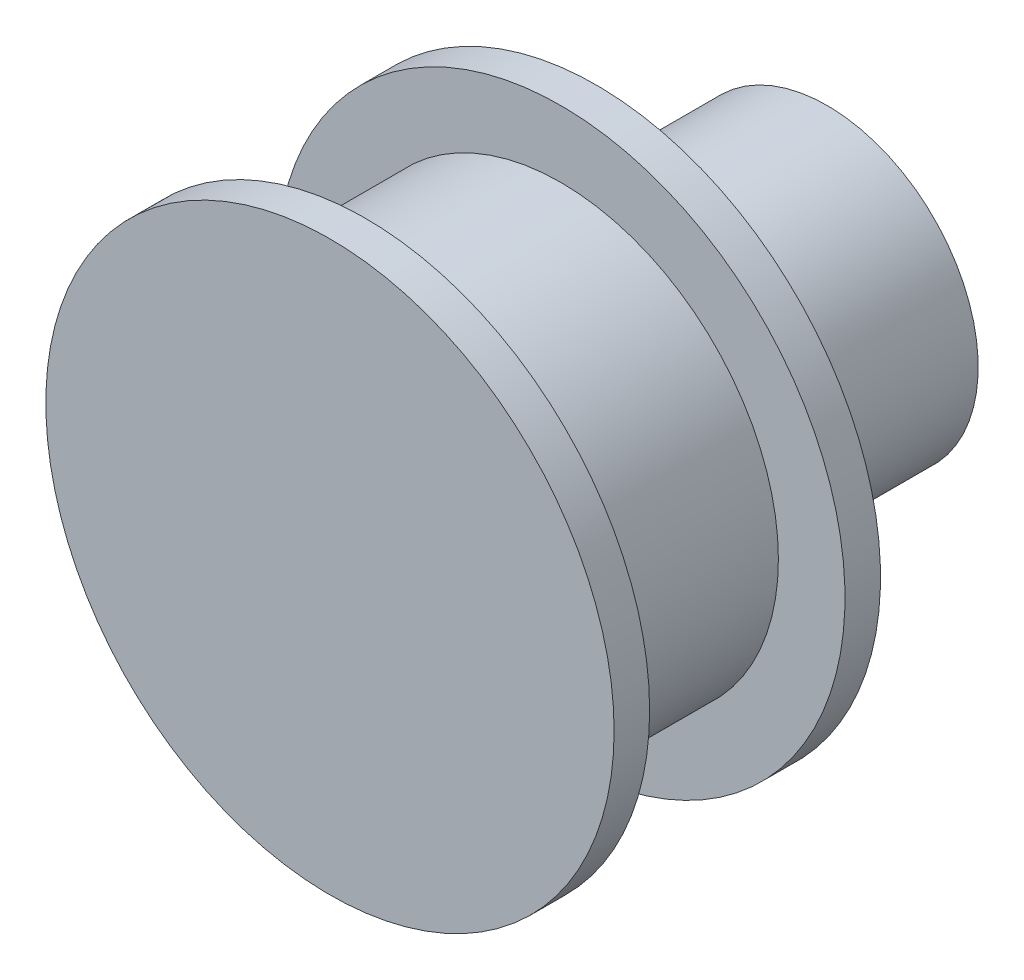
ISO-10303-21;
HEADER;
FILE_DESCRIPTION(('STEP AP214'),'2;1');
FILE_NAME('part.step','',(''),(''),'','','');
FILE_SCHEMA(('AUTOMOTIVE_DESIGN { 1 0 10303 214 1 1 1 1 }'));
ENDSEC;
DATA;
#1=APPLICATION_CONTEXT('core data for automotive mechanical design processes');
#2=APPLICATION_PROTOCOL_DEFINITION('international standard','automotive_design',2000,#1);
#3=PRODUCT_CONTEXT('',#1,'mechanical');
#4=PRODUCT('Part','Part','',(#3));
#5=PRODUCT_RELATED_PRODUCT_CATEGORY('part','',(#4));
#6=PRODUCT_DEFINITION_FORMATION('','',#4);
#7=PRODUCT_DEFINITION_CONTEXT('part definition',#1,'design');
#8=PRODUCT_DEFINITION('design','',#6,#7);
#9=PRODUCT_DEFINITION_SHAPE('','',#8);
#10=(LENGTH_UNIT() NAMED_UNIT(*) SI_UNIT(.MILLI.,.METRE.));
#11=(NAMED_UNIT(*) PLANE_ANGLE_UNIT() SI_UNIT($,.RADIAN.));
#12=(NAMED_UNIT(*) SI_UNIT($,.STERADIAN.) SOLID_ANGLE_UNIT());
#13=UNCERTAINTY_MEASURE_WITH_UNIT(LENGTH_MEASURE(1.E-05),#10,'distance_accuracy_value','');
#14=(GEOMETRIC_REPRESENTATION_CONTEXT(3) GLOBAL_UNCERTAINTY_ASSIGNED_CONTEXT((#13)) GLOBAL_UNIT_ASSIGNED_CONTEXT((#10,
#11,#12)) REPRESENTATION_CONTEXT('',''));
#15=CARTESIAN_POINT('',(0.,0.,0.));
#16=DIRECTION('',(0.,0.,1.));
#17=DIRECTION('',(1.,0.,0.));
#18=AXIS2_PLACEMENT_3D('',#15,#16,#17);
#19=CARTESIAN_POINT('',(0.,0.,-3.));
#20=DIRECTION('',(0.,0.,-1.));
#21=DIRECTION('',(-1.,0.,0.));
#22=AXIS2_PLACEMENT_3D('',#19,#20,#21);
#23=PLANE('',#22);
#24=CARTESIAN_POINT('',(0.,0.,-3.));
#25=DIRECTION('',(0.,0.,-1.));
#26=DIRECTION('',(-1.,0.,0.));
#27=AXIS2_PLACEMENT_3D('',#24,#25,#26);
#28=CIRCLE('',#27,10.);
#29=CARTESIAN_POINT('',(-10.,0.,-3.));
#30=VERTEX_POINT('',#29);
#31=EDGE_CURVE('E57',#30,#30,#28,.T.);
#32=ORIENTED_EDGE('',*,*,#31,.T.);
#33=EDGE_LOOP('',(#32));
#34=FACE_BOUND('',#33,.T.);
#35=CARTESIAN_POINT('',(0.,0.,-3.));
#36=DIRECTION('',(0.,0.,-1.));
#37=DIRECTION('',(-1.,0.,0.));
#38=AXIS2_PLACEMENT_3D('',#35,#36,#37);
#39=CIRCLE('',#38,8.5);
#40=CARTESIAN_POINT('',(-8.5,0.,-3.));
#41=VERTEX_POINT('',#40);
#42=EDGE_CURVE('E66',#41,#41,#39,.T.);
#43=ORIENTED_EDGE('',*,*,#42,.F.);
#44=EDGE_LOOP('',(#43));
#45=FACE_BOUND('',#44,.T.);
#46=ADVANCED_FACE('F33',(#34,#45),#23,.T.);
#47=CARTESIAN_POINT('',(0.,0.,-2.));
#48=DIRECTION('',(0.,0.,-1.));
#49=DIRECTION('',(-1.,0.,0.));
#50=AXIS2_PLACEMENT_3D('',#47,#48,#49);
#51=PLANE('',#50);
#52=CARTESIAN_POINT('',(0.,0.,-2.));
#53=DIRECTION('',(0.,0.,-1.));
#54=DIRECTION('',(-1.,0.,0.));
#55=AXIS2_PLACEMENT_3D('',#52,#53,#54);
#56=CIRCLE('',#55,16.);
#57=CARTESIAN_POINT('',(-16.,0.,-2.));
#58=VERTEX_POINT('',#57);
#59=EDGE_CURVE('E53',#58,#58,#56,.T.);
#60=ORIENTED_EDGE('',*,*,#59,.T.);
#61=EDGE_LOOP('',(#60));
#62=FACE_BOUND('',#61,.T.);
#63=CARTESIAN_POINT('',(0.,0.,-2.));
#64=DIRECTION('',(0.,0.,-1.));
#65=DIRECTION('',(-1.,0.,0.));
#66=AXIS2_PLACEMENT_3D('',#63,#64,#65);
#67=CIRCLE('',#66,10.);
#68=CARTESIAN_POINT('',(-10.,0.,-2.));
#69=VERTEX_POINT('',#68);
#70=EDGE_CURVE('E60',#69,#69,#67,.T.);
#71=ORIENTED_EDGE('',*,*,#70,.F.);
#72=EDGE_LOOP('',(#71));
#73=FACE_BOUND('',#72,.T.);
#74=ADVANCED_FACE('F100',(#62,#73),#51,.T.);
#75=CARTESIAN_POINT('',(0.,0.,11.));
#76=DIRECTION('',(0.,0.,-1.));
#77=DIRECTION('',(-1.,0.,0.));
#78=AXIS2_PLACEMENT_3D('',#75,#76,#77);
#79=CYLINDRICAL_SURFACE('',#78,12.25);
#80=CARTESIAN_POINT('',(0.,0.,11.));
#81=DIRECTION('',(0.,0.,1.));
#82=DIRECTION('',(1.,0.,0.));
#83=AXIS2_PLACEMENT_3D('',#80,#81,#82);
#84=CIRCLE('',#83,12.25);
#85=CARTESIAN_POINT('',(12.25,0.,11.));
#86=VERTEX_POINT('',#85);
#87=EDGE_CURVE('E44',#86,#86,#84,.T.);
#88=ORIENTED_EDGE('',*,*,#87,.F.);
#89=EDGE_LOOP('',(#88));
#90=FACE_BOUND('',#89,.T.);
#91=CARTESIAN_POINT('',(0.,0.,0.));
#92=DIRECTION('',(0.,0.,-1.));
#93=DIRECTION('',(-1.,0.,0.));
#94=AXIS2_PLACEMENT_3D('',#91,#92,#93);
#95=CIRCLE('',#94,12.25);
#96=CARTESIAN_POINT('',(-12.25,0.,0.));
#97=VERTEX_POINT('',#96);
#98=EDGE_CURVE('E48',#97,#97,#95,.T.);
#99=ORIENTED_EDGE('',*,*,#98,.F.);
#100=EDGE_LOOP('',(#99));
#101=FACE_BOUND('',#100,.T.);
#102=ADVANCED_FACE('F96',(#90,#101),#79,.T.);
#103=CARTESIAN_POINT('',(0.,0.,0.));
#104=DIRECTION('',(0.,0.,-1.));
#105=DIRECTION('',(-1.,0.,0.));
#106=AXIS2_PLACEMENT_3D('',#103,#104,#105);
#107=PLANE('',#106);
#108=CARTESIAN_POINT('',(0.,0.,0.));
#109=DIRECTION('',(0.,0.,-1.));
#110=DIRECTION('',(-1.,0.,0.));
#111=AXIS2_PLACEMENT_3D('',#108,#109,#110);
#112=CIRCLE('',#111,16.);
#113=CARTESIAN_POINT('',(-16.,0.,0.));
#114=VERTEX_POINT('',#113);
#115=EDGE_CURVE('E54',#114,#114,#112,.T.);
#116=ORIENTED_EDGE('',*,*,#115,.F.);
#117=EDGE_LOOP('',(#116));
#118=FACE_BOUND('',#117,.T.);
#119=ORIENTED_EDGE('',*,*,#98,.T.);
#120=EDGE_LOOP('',(#119));
#121=FACE_BOUND('',#120,.T.);
#122=ADVANCED_FACE('F99',(#118,#121),#107,.F.);
#123=CARTESIAN_POINT('',(0.,0.,-2.));
#124=DIRECTION('',(0.,0.,1.));
#125=DIRECTION('',(1.,0.,0.));
#126=AXIS2_PLACEMENT_3D('',#123,#124,#125);
#127=CYLINDRICAL_SURFACE('',#126,16.);
#128=ORIENTED_EDGE('',*,*,#59,.F.);
#129=EDGE_LOOP('',(#128));
#130=FACE_BOUND('',#129,.T.);
#131=ORIENTED_EDGE('',*,*,#115,.T.);
#132=EDGE_LOOP('',(#131));
#133=FACE_BOUND('',#132,.T.);
#134=ADVANCED_FACE('F104',(#130,#133),#127,.T.);
#135=CARTESIAN_POINT('',(0.,0.,-3.));
#136=DIRECTION('',(0.,0.,1.));
#137=DIRECTION('',(1.,0.,0.));
#138=AXIS2_PLACEMENT_3D('',#135,#136,#137);
#139=CYLINDRICAL_SURFACE('',#138,10.);
#140=ORIENTED_EDGE('',*,*,#31,.F.);
#141=EDGE_LOOP('',(#140));
#142=FACE_BOUND('',#141,.T.);
#143=ORIENTED_EDGE('',*,*,#70,.T.);
#144=EDGE_LOOP('',(#143));
#145=FACE_BOUND('',#144,.T.);
#146=ADVANCED_FACE('F110',(#142,#145),#139,.T.);
#147=CARTESIAN_POINT('',(0.,0.,-15.));
#148=DIRECTION('',(0.,0.,1.));
#149=DIRECTION('',(1.,0.,0.));
#150=AXIS2_PLACEMENT_3D('',#147,#148,#149);
#151=CYLINDRICAL_SURFACE('',#150,8.5);
#152=CARTESIAN_POINT('',(0.,0.,-15.));
#153=DIRECTION('',(0.,0.,-1.));
#154=DIRECTION('',(-1.,0.,0.));
#155=AXIS2_PLACEMENT_3D('',#152,#153,#154);
#156=CIRCLE('',#155,8.5);
#157=CARTESIAN_POINT('',(-8.5,0.,-15.));
#158=VERTEX_POINT('',#157);
#159=EDGE_CURVE('E63',#158,#158,#156,.T.);
#160=ORIENTED_EDGE('',*,*,#159,.F.);
#161=EDGE_LOOP('',(#160));
#162=FACE_BOUND('',#161,.T.);
#163=ORIENTED_EDGE('',*,*,#42,.T.);
#164=EDGE_LOOP('',(#163));
#165=FACE_BOUND('',#164,.T.);
#166=ADVANCED_FACE('F125',(#162,#165),#151,.T.);
#167=CARTESIAN_POINT('',(0.,0.,-15.));
#168=DIRECTION('',(0.,0.,-1.));
#169=DIRECTION('',(-1.,0.,0.));
#170=AXIS2_PLACEMENT_3D('',#167,#168,#169);
#171=PLANE('',#170);
#172=CARTESIAN_POINT('',(0.,0.,-15.));
#173=DIRECTION('',(0.,0.,-1.));
#174=DIRECTION('',(-1.,0.,0.));
#175=AXIS2_PLACEMENT_3D('',#172,#173,#174);
#176=CIRCLE('',#175,7.00000000000003);
#177=CARTESIAN_POINT('',(-7.00000000000003,0.,-15.));
#178=VERTEX_POINT('',#177);
#179=EDGE_CURVE('E10',#178,#178,#176,.F.);
#180=ORIENTED_EDGE('',*,*,#179,.T.);
#181=EDGE_LOOP('',(#180));
#182=FACE_BOUND('',#181,.T.);
#183=ORIENTED_EDGE('',*,*,#159,.T.);
#184=EDGE_LOOP('',(#183));
#185=FACE_BOUND('',#184,.T.);
#186=ADVANCED_FACE('F132',(#182,#185),#171,.T.);
#187=CARTESIAN_POINT('',(0.,0.,11.));
#188=DIRECTION('',(0.,0.,-1.));
#189=DIRECTION('',(-1.,0.,0.));
#190=AXIS2_PLACEMENT_3D('',#187,#188,#189);
#191=CYLINDRICAL_SURFACE('',#190,6.);
#192=CARTESIAN_POINT('',(0.,0.,-14.));
#193=DIRECTION('',(0.,0.,-1.));
#194=DIRECTION('',(-1.,0.,0.));
#195=AXIS2_PLACEMENT_3D('',#192,#193,#194);
#196=CIRCLE('',#195,6.);
#197=CARTESIAN_POINT('',(-6.,0.,-14.));
#198=VERTEX_POINT('',#197);
#199=EDGE_CURVE('E40',#198,#198,#196,.T.);
#200=CARTESIAN_POINT('',(0.,0.,11.));
#201=DIRECTION('',(0.,0.,-1.));
#202=DIRECTION('',(-1.,0.,0.));
#203=AXIS2_PLACEMENT_3D('',#200,#201,#202);
#204=CIRCLE('',#203,6.);
#205=CARTESIAN_POINT('',(-6.,0.,11.));
#206=VERTEX_POINT('',#205);
#207=EDGE_CURVE('E69',#206,#206,#204,.T.);
#208=CARTESIAN_POINT('',(-6.,0.,-14.));
#209=CARTESIAN_POINT('',(-6.,0.,-13.7395833333333));
#210=CARTESIAN_POINT('',(-6.,0.,-13.4791666666666));
#211=CARTESIAN_POINT('',(-6.,0.,-12.9583333333333));
#212=CARTESIAN_POINT('',(-6.,0.,-12.6979166666666));
#213=CARTESIAN_POINT('',(-6.,0.,-12.1770833333333));
#214=CARTESIAN_POINT('',(-6.,0.,-11.9166666666666));
#215=CARTESIAN_POINT('',(-6.,0.,-11.3958333333333));
#216=CARTESIAN_POINT('',(-6.,0.,-11.1354166666666));
#217=CARTESIAN_POINT('',(-6.,0.,-10.6145833333333));
#218=CARTESIAN_POINT('',(-6.,0.,-10.3541666666666));
#219=CARTESIAN_POINT('',(-6.,0.,-9.83333333333331));
#220=CARTESIAN_POINT('',(-6.,0.,-9.57291666666664));
#221=CARTESIAN_POINT('',(-6.,0.,-9.05208333333331));
#222=CARTESIAN_POINT('',(-6.,0.,-8.79166666666664));
#223=CARTESIAN_POINT('',(-6.,0.,-8.27083333333331));
#224=CARTESIAN_POINT('',(-6.,0.,-8.01041666666664));
#225=CARTESIAN_POINT('',(-6.,0.,-7.48958333333331));
#226=CARTESIAN_POINT('',(-6.,0.,-7.22916666666664));
#227=CARTESIAN_POINT('',(-6.,0.,-6.70833333333331));
#228=CARTESIAN_POINT('',(-6.,0.,-6.44791666666664));
#229=CARTESIAN_POINT('',(-6.,0.,-5.92708333333331));
#230=CARTESIAN_POINT('',(-6.,0.,-5.66666666666665));
#231=CARTESIAN_POINT('',(-6.,0.,-5.14583333333331));
#232=CARTESIAN_POINT('',(-6.,0.,-4.88541666666665));
#233=CARTESIAN_POINT('',(-6.,0.,-4.36458333333332));
#234=CARTESIAN_POINT('',(-6.,0.,-4.10416666666665));
#235=CARTESIAN_POINT('',(-6.,0.,-3.58333333333332));
#236=CARTESIAN_POINT('',(-6.,0.,-3.32291666666665));
#237=CARTESIAN_POINT('',(-6.,0.,-2.80208333333332));
#238=CARTESIAN_POINT('',(-6.,0.,-2.54166666666665));
#239=CARTESIAN_POINT('',(-6.,0.,-2.02083333333332));
#240=CARTESIAN_POINT('',(-6.,0.,-1.76041666666665));
#241=CARTESIAN_POINT('',(-6.,0.,-1.23958333333332));
#242=CARTESIAN_POINT('',(-6.,0.,-0.979166666666653));
#243=CARTESIAN_POINT('',(-6.,0.,-0.45833333333332));
#244=CARTESIAN_POINT('',(-6.,0.,-0.197916666666654));
#245=CARTESIAN_POINT('',(-6.,0.,0.322916666666679));
#246=CARTESIAN_POINT('',(-6.,0.,0.583333333333345));
#247=CARTESIAN_POINT('',(-6.,0.,1.10416666666668));
#248=CARTESIAN_POINT('',(-6.,0.,1.36458333333334));
#249=CARTESIAN_POINT('',(-6.,0.,1.88541666666668));
#250=CARTESIAN_POINT('',(-6.,0.,2.14583333333334));
#251=CARTESIAN_POINT('',(-6.,0.,2.66666666666668));
#252=CARTESIAN_POINT('',(-6.,0.,2.92708333333334));
#253=CARTESIAN_POINT('',(-6.,0.,3.44791666666667));
#254=CARTESIAN_POINT('',(-6.,0.,3.70833333333334));
#255=CARTESIAN_POINT('',(-6.,0.,4.22916666666667));
#256=CARTESIAN_POINT('',(-6.,0.,4.48958333333334));
#257=CARTESIAN_POINT('',(-6.,0.,5.01041666666667));
#258=CARTESIAN_POINT('',(-6.,0.,5.27083333333334));
#259=CARTESIAN_POINT('',(-6.,0.,5.79166666666667));
#260=CARTESIAN_POINT('',(-6.,0.,6.05208333333334));
#261=CARTESIAN_POINT('',(-6.,0.,6.57291666666667));
#262=CARTESIAN_POINT('',(-6.,0.,6.83333333333334));
#263=CARTESIAN_POINT('',(-6.,0.,7.35416666666667));
#264=CARTESIAN_POINT('',(-6.,0.,7.61458333333334));
#265=CARTESIAN_POINT('',(-6.,0.,8.13541666666667));
#266=CARTESIAN_POINT('',(-6.,0.,8.39583333333334));
#267=CARTESIAN_POINT('',(-6.,0.,8.91666666666667));
#268=CARTESIAN_POINT('',(-6.,0.,9.17708333333333));
#269=CARTESIAN_POINT('',(-6.,0.,9.69791666666667));
#270=CARTESIAN_POINT('',(-6.,0.,9.95833333333333));
#271=CARTESIAN_POINT('',(-6.,0.,10.4791666666667));
#272=CARTESIAN_POINT('',(-6.,0.,10.7395833333333));
#273=CARTESIAN_POINT('',(-6.,0.,11.));
#274=B_SPLINE_CURVE_WITH_KNOTS('',3,(#208,#209,#210,#211,#212,#213,#214,#215,#216,#217,#218,
#219,#220,#221,#222,#223,#224,#225,#226,#227,#228,#229,#230,#231,#232,#233,#234,#235,#236,#237,
#238,#239,#240,#241,#242,#243,#244,#245,#246,#247,#248,#249,#250,#251,#252,#253,#254,#255,#256,
#257,#258,#259,#260,#261,#262,#263,#264,#265,#266,#267,#268,#269,#270,#271,#272,#273),
.UNSPECIFIED.,.F.,.F.,(4,2,2,2,2,2,2,2,2,2,2,2,2,2,2,2,2,2,2,2,2,2,2,2,2,2,2,2,2,2,2,2,4),(0.,
0.781250000000001,1.5625,2.34375,3.125,3.90625,4.6875,5.46874999999999,6.24999999999999,
7.03124999999999,7.81249999999999,8.59374999999999,9.37499999999999,10.15625,10.9375,11.71875,
12.5,13.28125,14.0625,14.84375,15.625,16.40625,17.1875,17.96875,18.75,19.53125,20.3125,21.09375,
21.875,22.65625,23.4375,24.21875,25.),.UNSPECIFIED.);
#275=EDGE_CURVE('BSEAM141',#198,#206,#274,.T.);
#276=ORIENTED_EDGE('',*,*,#199,.T.);
#277=ORIENTED_EDGE('',*,*,#207,.F.);
#278=ORIENTED_EDGE('',*,*,#275,.T.);
#279=ORIENTED_EDGE('',*,*,#275,.F.);
#280=EDGE_LOOP('',(#276,#278,#277,#279));
#281=FACE_BOUND('',#280,.T.);
#282=ADVANCED_FACE('F141',(#281),#191,.F.);
#283=CARTESIAN_POINT('',(0.,0.,-14.));
#284=DIRECTION('',(0.,0.,-1.));
#285=DIRECTION('',(-1.,0.,0.));
#286=AXIS2_PLACEMENT_3D('',#283,#284,#285);
#287=CONICAL_SURFACE('',#286,6.,0.785398163397452);
#288=ORIENTED_EDGE('',*,*,#179,.F.);
#289=EDGE_LOOP('',(#288));
#290=FACE_BOUND('',#289,.T.);
#291=ORIENTED_EDGE('',*,*,#199,.F.);
#292=EDGE_LOOP('',(#291));
#293=FACE_BOUND('',#292,.T.);
#294=ADVANCED_FACE('F35',(#290,#293),#287,.F.);
#295=CARTESIAN_POINT('',(0.,0.,11.));
#296=DIRECTION('',(0.,0.,1.));
#297=DIRECTION('',(1.,0.,0.));
#298=AXIS2_PLACEMENT_3D('',#295,#296,#297);
#299=PLANE('',#298);
#300=ORIENTED_EDGE('',*,*,#207,.T.);
#301=EDGE_LOOP('',(#300));
#302=FACE_BOUND('',#301,.T.);
#303=ADVANCED_FACE('F92',(#302),#299,.F.);
#304=CARTESIAN_POINT('',(0.,0.,11.));
#305=DIRECTION('',(0.,0.,1.));
#306=DIRECTION('',(1.,0.,0.));
#307=AXIS2_PLACEMENT_3D('',#304,#305,#306);
#308=CIRCLE('',#307,16.);
#309=CARTESIAN_POINT('',(16.,0.,11.));
#310=VERTEX_POINT('',#309);
#311=EDGE_CURVE('E75',#310,#310,#308,.T.);
#312=ORIENTED_EDGE('',*,*,#311,.F.);
#313=EDGE_LOOP('',(#312));
#314=FACE_BOUND('',#313,.T.);
#315=ORIENTED_EDGE('',*,*,#87,.T.);
#316=EDGE_LOOP('',(#315));
#317=FACE_BOUND('',#316,.T.);
#318=ADVANCED_FACE('F86',(#314,#317),#299,.F.);
#319=CARTESIAN_POINT('',(0.,0.,13.));
#320=DIRECTION('',(0.,0.,-1.));
#321=DIRECTION('',(-1.,0.,0.));
#322=AXIS2_PLACEMENT_3D('',#319,#320,#321);
#323=CYLINDRICAL_SURFACE('',#322,16.);
#324=CARTESIAN_POINT('',(0.,0.,13.));
#325=DIRECTION('',(0.,0.,1.));
#326=DIRECTION('',(1.,0.,0.));
#327=AXIS2_PLACEMENT_3D('',#324,#325,#326);
#328=CIRCLE('',#327,16.);
#329=CARTESIAN_POINT('',(16.,0.,13.));
#330=VERTEX_POINT('',#329);
#331=EDGE_CURVE('E74',#330,#330,#328,.T.);
#332=ORIENTED_EDGE('',*,*,#331,.F.);
#333=EDGE_LOOP('',(#332));
#334=FACE_BOUND('',#333,.T.);
#335=ORIENTED_EDGE('',*,*,#311,.T.);
#336=EDGE_LOOP('',(#335));
#337=FACE_BOUND('',#336,.T.);
#338=ADVANCED_FACE('F83',(#334,#337),#323,.T.);
#339=CARTESIAN_POINT('',(0.,0.,13.));
#340=DIRECTION('',(0.,0.,1.));
#341=DIRECTION('',(1.,0.,0.));
#342=AXIS2_PLACEMENT_3D('',#339,#340,#341);
#343=PLANE('',#342);
#344=ORIENTED_EDGE('',*,*,#331,.T.);
#345=EDGE_LOOP('',(#344));
#346=FACE_BOUND('',#345,.T.);
#347=ADVANCED_FACE('F81',(#346),#343,.T.);
#348=CLOSED_SHELL('',(#46,#74,#102,#122,#134,#146,#166,#186,#282,#294,#303,#318,#338,#347));
#349=MANIFOLD_SOLID_BREP('B2',#348);
#350=ADVANCED_BREP_SHAPE_REPRESENTATION('',(#18,#349),#14);
#351=SHAPE_DEFINITION_REPRESENTATION(#9,#350);
ENDSEC;
END-ISO-10303-21;
